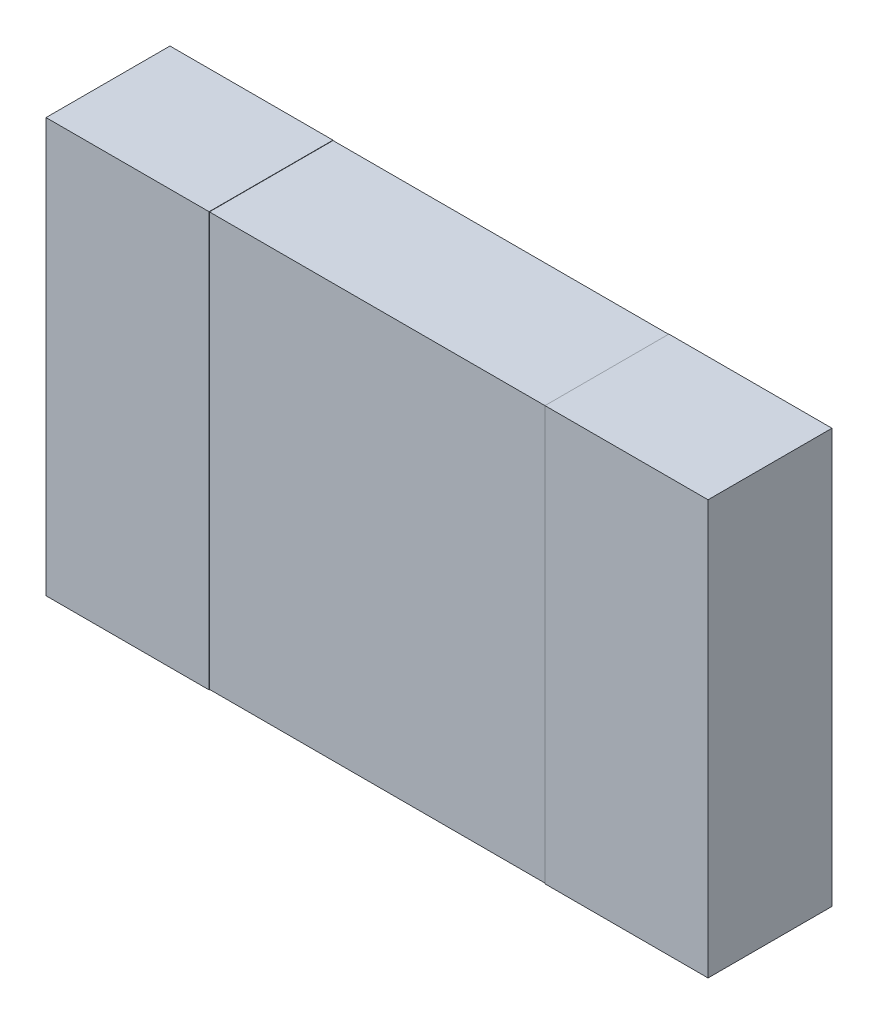
ISO-10303-21;
HEADER;
FILE_DESCRIPTION(('STEP AP214'),'2;1');
FILE_NAME('part.step','',(''),(''),'','','');
FILE_SCHEMA(('AUTOMOTIVE_DESIGN { 1 0 10303 214 1 1 1 1 }'));
ENDSEC;
DATA;
#1=APPLICATION_CONTEXT('core data for automotive mechanical design processes');
#2=APPLICATION_PROTOCOL_DEFINITION('international standard','automotive_design',2000,#1);
#3=PRODUCT_CONTEXT('',#1,'mechanical');
#4=PRODUCT('Part','Part','',(#3));
#5=PRODUCT_RELATED_PRODUCT_CATEGORY('part','',(#4));
#6=PRODUCT_DEFINITION_FORMATION('','',#4);
#7=PRODUCT_DEFINITION_CONTEXT('part definition',#1,'design');
#8=PRODUCT_DEFINITION('design','',#6,#7);
#9=PRODUCT_DEFINITION_SHAPE('','',#8);
#10=(LENGTH_UNIT() NAMED_UNIT(*) SI_UNIT(.MILLI.,.METRE.));
#11=(NAMED_UNIT(*) PLANE_ANGLE_UNIT() SI_UNIT($,.RADIAN.));
#12=(NAMED_UNIT(*) SI_UNIT($,.STERADIAN.) SOLID_ANGLE_UNIT());
#13=UNCERTAINTY_MEASURE_WITH_UNIT(LENGTH_MEASURE(1.E-05),#10,'distance_accuracy_value','');
#14=(GEOMETRIC_REPRESENTATION_CONTEXT(3) GLOBAL_UNCERTAINTY_ASSIGNED_CONTEXT((#13)) GLOBAL_UNIT_ASSIGNED_CONTEXT((#10,
#11,#12)) REPRESENTATION_CONTEXT('',''));
#15=CARTESIAN_POINT('',(0.,0.,0.));
#16=DIRECTION('',(0.,0.,1.));
#17=DIRECTION('',(1.,0.,0.));
#18=AXIS2_PLACEMENT_3D('',#15,#16,#17);
#19=CARTESIAN_POINT('',(0.,0.,0.38));
#20=DIRECTION('',(0.,0.,1.));
#21=DIRECTION('',(1.,0.,0.));
#22=AXIS2_PLACEMENT_3D('',#19,#20,#21);
#23=PLANE('',#22);
#24=DIRECTION('',(1.084202172485E-13,1.,0.));
#25=VECTOR('',#24,1.);
#26=CARTESIAN_POINT('',(0.515,0.635,0.38));
#27=LINE('',#26,#25);
#28=CARTESIAN_POINT('',(0.515,0.635,0.38));
#29=VERTEX_POINT('',#28);
#30=CARTESIAN_POINT('',(0.514999999999862,-0.635,0.38));
#31=VERTEX_POINT('',#30);
#32=EDGE_CURVE('E191',#29,#31,#27,.F.);
#33=ORIENTED_EDGE('',*,*,#32,.T.);
#34=DIRECTION('',(1.,0.,0.));
#35=VECTOR('',#34,1.);
#36=CARTESIAN_POINT('',(-1.015,-0.635,0.38));
#37=LINE('',#36,#35);
#38=CARTESIAN_POINT('',(1.015,-0.635,0.38));
#39=VERTEX_POINT('',#38);
#40=EDGE_CURVE('E121',#31,#39,#37,.T.);
#41=ORIENTED_EDGE('',*,*,#40,.T.);
#42=DIRECTION('',(0.,-1.,0.));
#43=VECTOR('',#42,1.);
#44=CARTESIAN_POINT('',(1.015,0.635,0.38));
#45=LINE('',#44,#43);
#46=CARTESIAN_POINT('',(1.015,0.635,0.38));
#47=VERTEX_POINT('',#46);
#48=EDGE_CURVE('E120',#39,#47,#45,.F.);
#49=ORIENTED_EDGE('',*,*,#48,.T.);
#50=DIRECTION('',(1.,0.,0.));
#51=VECTOR('',#50,1.);
#52=CARTESIAN_POINT('',(-1.015,0.635,0.38));
#53=LINE('',#52,#51);
#54=EDGE_CURVE('E118',#47,#29,#53,.F.);
#55=ORIENTED_EDGE('',*,*,#54,.T.);
#56=EDGE_LOOP('',(#33,#41,#49,#55));
#57=FACE_BOUND('',#56,.T.);
#58=ADVANCED_FACE('F17',(#57),#23,.T.);
#59=CARTESIAN_POINT('',(0.515,-0.635,0.379));
#60=DIRECTION('',(0.,0.,-1.));
#61=DIRECTION('',(-1.,0.,0.));
#62=AXIS2_PLACEMENT_3D('',#59,#60,#61);
#63=PLANE('',#62);
#64=DIRECTION('',(0.,1.,0.));
#65=VECTOR('',#64,1.);
#66=CARTESIAN_POINT('',(-0.515,0.635,0.379));
#67=LINE('',#66,#65);
#68=CARTESIAN_POINT('',(-0.515,0.634,0.379));
#69=VERTEX_POINT('',#68);
#70=CARTESIAN_POINT('',(-0.515,-0.634,0.379));
#71=VERTEX_POINT('',#70);
#72=EDGE_CURVE('E171',#69,#71,#67,.F.);
#73=ORIENTED_EDGE('',*,*,#72,.T.);
#74=DIRECTION('',(1.,0.,0.));
#75=VECTOR('',#74,1.);
#76=CARTESIAN_POINT('',(0.515,-0.634,0.379));
#77=LINE('',#76,#75);
#78=CARTESIAN_POINT('',(0.514999999999893,-0.634,0.379));
#79=VERTEX_POINT('',#78);
#80=EDGE_CURVE('E100',#71,#79,#77,.T.);
#81=ORIENTED_EDGE('',*,*,#80,.T.);
#82=DIRECTION('',(1.084202172485E-13,1.,0.));
#83=VECTOR('',#82,1.);
#84=CARTESIAN_POINT('',(0.515,0.635,0.379));
#85=LINE('',#84,#83);
#86=CARTESIAN_POINT('',(0.515,0.634,0.379));
#87=VERTEX_POINT('',#86);
#88=EDGE_CURVE('E104',#79,#87,#85,.T.);
#89=ORIENTED_EDGE('',*,*,#88,.T.);
#90=DIRECTION('',(1.,0.,0.));
#91=VECTOR('',#90,1.);
#92=CARTESIAN_POINT('',(0.515,0.634,0.379));
#93=LINE('',#92,#91);
#94=EDGE_CURVE('E152',#87,#69,#93,.F.);
#95=ORIENTED_EDGE('',*,*,#94,.T.);
#96=EDGE_LOOP('',(#73,#81,#89,#95));
#97=FACE_BOUND('',#96,.T.);
#98=ADVANCED_FACE('F269',(#97),#63,.F.);
#99=CARTESIAN_POINT('',(0.,0.,0.38));
#100=DIRECTION('',(0.,0.,1.));
#101=DIRECTION('',(1.,0.,0.));
#102=AXIS2_PLACEMENT_3D('',#99,#100,#101);
#103=PLANE('',#102);
#104=DIRECTION('',(1.,0.,0.));
#105=VECTOR('',#104,1.);
#106=CARTESIAN_POINT('',(-1.015,-0.635,0.38));
#107=LINE('',#106,#105);
#108=CARTESIAN_POINT('',(-1.015,-0.635,0.38));
#109=VERTEX_POINT('',#108);
#110=CARTESIAN_POINT('',(-0.515,-0.635,0.38));
#111=VERTEX_POINT('',#110);
#112=EDGE_CURVE('E161',#109,#111,#107,.T.);
#113=ORIENTED_EDGE('',*,*,#112,.T.);
#114=DIRECTION('',(0.,1.,0.));
#115=VECTOR('',#114,1.);
#116=CARTESIAN_POINT('',(-0.515,0.635,0.38));
#117=LINE('',#116,#115);
#118=CARTESIAN_POINT('',(-0.515,0.635,0.38));
#119=VERTEX_POINT('',#118);
#120=EDGE_CURVE('E155',#111,#119,#117,.T.);
#121=ORIENTED_EDGE('',*,*,#120,.T.);
#122=DIRECTION('',(1.,0.,0.));
#123=VECTOR('',#122,1.);
#124=CARTESIAN_POINT('',(-1.015,0.635,0.38));
#125=LINE('',#124,#123);
#126=CARTESIAN_POINT('',(-1.015,0.635,0.38));
#127=VERTEX_POINT('',#126);
#128=EDGE_CURVE('E149',#119,#127,#125,.F.);
#129=ORIENTED_EDGE('',*,*,#128,.T.);
#130=DIRECTION('',(0.,1.,0.));
#131=VECTOR('',#130,1.);
#132=CARTESIAN_POINT('',(-1.015,0.635,0.38));
#133=LINE('',#132,#131);
#134=EDGE_CURVE('E180',#127,#109,#133,.F.);
#135=ORIENTED_EDGE('',*,*,#134,.T.);
#136=EDGE_LOOP('',(#113,#121,#129,#135));
#137=FACE_BOUND('',#136,.T.);
#138=ADVANCED_FACE('F363',(#137),#103,.T.);
#139=CARTESIAN_POINT('',(0.515,-0.634,0.38));
#140=DIRECTION('',(0.,1.,0.));
#141=DIRECTION('',(0.,0.,1.));
#142=AXIS2_PLACEMENT_3D('',#139,#140,#141);
#143=PLANE('',#142);
#144=DIRECTION('',(0.,0.,1.));
#145=VECTOR('',#144,1.);
#146=CARTESIAN_POINT('',(-0.515,-0.634,0.38));
#147=LINE('',#146,#145);
#148=CARTESIAN_POINT('',(-0.515,-0.634,0.));
#149=VERTEX_POINT('',#148);
#150=EDGE_CURVE('E173',#71,#149,#147,.F.);
#151=ORIENTED_EDGE('',*,*,#150,.T.);
#152=DIRECTION('',(1.,0.,0.));
#153=VECTOR('',#152,1.);
#154=CARTESIAN_POINT('',(0.,-0.634,0.));
#155=LINE('',#154,#153);
#156=CARTESIAN_POINT('',(0.514999999999862,-0.634,0.));
#157=VERTEX_POINT('',#156);
#158=EDGE_CURVE('E217',#149,#157,#155,.T.);
#159=ORIENTED_EDGE('',*,*,#158,.T.);
#160=DIRECTION('',(0.,0.,1.));
#161=VECTOR('',#160,1.);
#162=CARTESIAN_POINT('',(0.514999999999862,-0.634,0.38));
#163=LINE('',#162,#161);
#164=EDGE_CURVE('E65',#157,#79,#163,.T.);
#165=ORIENTED_EDGE('',*,*,#164,.T.);
#166=ORIENTED_EDGE('',*,*,#80,.F.);
#167=EDGE_LOOP('',(#151,#159,#165,#166));
#168=FACE_BOUND('',#167,.T.);
#169=ADVANCED_FACE('F256',(#168),#143,.F.);
#170=CARTESIAN_POINT('',(-1.015,-0.635,0.38));
#171=DIRECTION('',(0.,1.,0.));
#172=DIRECTION('',(0.,0.,1.));
#173=AXIS2_PLACEMENT_3D('',#170,#171,#172);
#174=PLANE('',#173);
#175=DIRECTION('',(1.,0.,0.));
#176=VECTOR('',#175,1.);
#177=CARTESIAN_POINT('',(0.,-0.635,0.));
#178=LINE('',#177,#176);
#179=CARTESIAN_POINT('',(0.514999999999862,-0.635,0.));
#180=VERTEX_POINT('',#179);
#181=CARTESIAN_POINT('',(1.015,-0.635,0.));
#182=VERTEX_POINT('',#181);
#183=EDGE_CURVE('E143',#180,#182,#178,.T.);
#184=ORIENTED_EDGE('',*,*,#183,.T.);
#185=DIRECTION('',(0.,0.,1.));
#186=VECTOR('',#185,1.);
#187=CARTESIAN_POINT('',(1.015,-0.635,0.38));
#188=LINE('',#187,#186);
#189=EDGE_CURVE('E81',#182,#39,#188,.T.);
#190=ORIENTED_EDGE('',*,*,#189,.T.);
#191=ORIENTED_EDGE('',*,*,#40,.F.);
#192=DIRECTION('',(0.,0.,1.));
#193=VECTOR('',#192,1.);
#194=CARTESIAN_POINT('',(0.514999999999862,-0.635,0.38));
#195=LINE('',#194,#193);
#196=EDGE_CURVE('E73',#31,#180,#195,.F.);
#197=ORIENTED_EDGE('',*,*,#196,.T.);
#198=EDGE_LOOP('',(#184,#190,#191,#197));
#199=FACE_BOUND('',#198,.T.);
#200=ADVANCED_FACE('F350',(#199),#174,.F.);
#201=CARTESIAN_POINT('',(1.015,0.635,0.38));
#202=DIRECTION('',(-1.,0.,0.));
#203=DIRECTION('',(0.,-1.,0.));
#204=AXIS2_PLACEMENT_3D('',#201,#202,#203);
#205=PLANE('',#204);
#206=ORIENTED_EDGE('',*,*,#48,.F.);
#207=ORIENTED_EDGE('',*,*,#189,.F.);
#208=DIRECTION('',(0.,1.,0.));
#209=VECTOR('',#208,1.);
#210=CARTESIAN_POINT('',(1.015,0.,0.));
#211=LINE('',#210,#209);
#212=CARTESIAN_POINT('',(1.015,0.635,0.));
#213=VERTEX_POINT('',#212);
#214=EDGE_CURVE('E133',#182,#213,#211,.T.);
#215=ORIENTED_EDGE('',*,*,#214,.T.);
#216=DIRECTION('',(0.,0.,-1.));
#217=VECTOR('',#216,1.);
#218=CARTESIAN_POINT('',(1.015,0.635,0.38));
#219=LINE('',#218,#217);
#220=EDGE_CURVE('E123',#213,#47,#219,.F.);
#221=ORIENTED_EDGE('',*,*,#220,.T.);
#222=EDGE_LOOP('',(#206,#207,#215,#221));
#223=FACE_BOUND('',#222,.T.);
#224=ADVANCED_FACE('F132',(#223),#205,.F.);
#225=CARTESIAN_POINT('',(-1.015,0.635,0.38));
#226=DIRECTION('',(0.,-1.,0.));
#227=DIRECTION('',(0.,0.,-1.));
#228=AXIS2_PLACEMENT_3D('',#225,#226,#227);
#229=PLANE('',#228);
#230=ORIENTED_EDGE('',*,*,#54,.F.);
#231=ORIENTED_EDGE('',*,*,#220,.F.);
#232=DIRECTION('',(1.,0.,0.));
#233=VECTOR('',#232,1.);
#234=CARTESIAN_POINT('',(0.,0.635,0.));
#235=LINE('',#234,#233);
#236=CARTESIAN_POINT('',(0.515,0.635,0.));
#237=VERTEX_POINT('',#236);
#238=EDGE_CURVE('E142',#213,#237,#235,.F.);
#239=ORIENTED_EDGE('',*,*,#238,.T.);
#240=DIRECTION('',(0.,0.,1.));
#241=VECTOR('',#240,1.);
#242=CARTESIAN_POINT('',(0.515,0.635,0.38));
#243=LINE('',#242,#241);
#244=EDGE_CURVE('E130',#237,#29,#243,.T.);
#245=ORIENTED_EDGE('',*,*,#244,.T.);
#246=EDGE_LOOP('',(#230,#231,#239,#245));
#247=FACE_BOUND('',#246,.T.);
#248=ADVANCED_FACE('F127',(#247),#229,.F.);
#249=CARTESIAN_POINT('',(0.515,0.635,0.38));
#250=DIRECTION('',(1.,-1.084202172485E-13,0.));
#251=DIRECTION('',(1.084202172485E-13,1.,0.));
#252=AXIS2_PLACEMENT_3D('',#249,#250,#251);
#253=PLANE('',#252);
#254=ORIENTED_EDGE('',*,*,#88,.F.);
#255=ORIENTED_EDGE('',*,*,#164,.F.);
#256=DIRECTION('',(1.084202172485E-13,1.,0.));
#257=VECTOR('',#256,1.);
#258=CARTESIAN_POINT('',(0.515,0.635,0.));
#259=LINE('',#258,#257);
#260=EDGE_CURVE('E20',#157,#180,#259,.F.);
#261=ORIENTED_EDGE('',*,*,#260,.T.);
#262=ORIENTED_EDGE('',*,*,#196,.F.);
#263=ORIENTED_EDGE('',*,*,#32,.F.);
#264=ORIENTED_EDGE('',*,*,#244,.F.);
#265=DIRECTION('',(1.084202172485E-13,1.,0.));
#266=VECTOR('',#265,1.);
#267=CARTESIAN_POINT('',(0.515,0.635,0.));
#268=LINE('',#267,#266);
#269=CARTESIAN_POINT('',(0.515,0.634,0.));
#270=VERTEX_POINT('',#269);
#271=EDGE_CURVE('E203',#237,#270,#268,.F.);
#272=ORIENTED_EDGE('',*,*,#271,.T.);
#273=DIRECTION('',(0.,0.,-1.));
#274=VECTOR('',#273,1.);
#275=CARTESIAN_POINT('',(0.515,0.634,0.38));
#276=LINE('',#275,#274);
#277=EDGE_CURVE('E177',#270,#87,#276,.F.);
#278=ORIENTED_EDGE('',*,*,#277,.T.);
#279=EDGE_LOOP('',(#254,#255,#261,#262,#263,#264,#272,#278));
#280=FACE_BOUND('',#279,.T.);
#281=ADVANCED_FACE('F262',(#280),#253,.F.);
#282=CARTESIAN_POINT('',(0.515,0.634,0.38));
#283=DIRECTION('',(0.,-1.,0.));
#284=DIRECTION('',(0.,0.,-1.));
#285=AXIS2_PLACEMENT_3D('',#282,#283,#284);
#286=PLANE('',#285);
#287=ORIENTED_EDGE('',*,*,#277,.F.);
#288=DIRECTION('',(1.,0.,0.));
#289=VECTOR('',#288,1.);
#290=CARTESIAN_POINT('',(0.,0.634,0.));
#291=LINE('',#290,#289);
#292=CARTESIAN_POINT('',(-0.515,0.634,0.));
#293=VERTEX_POINT('',#292);
#294=EDGE_CURVE('E202',#270,#293,#291,.F.);
#295=ORIENTED_EDGE('',*,*,#294,.T.);
#296=DIRECTION('',(0.,0.,1.));
#297=VECTOR('',#296,1.);
#298=CARTESIAN_POINT('',(-0.515,0.634,0.38));
#299=LINE('',#298,#297);
#300=EDGE_CURVE('E164',#293,#69,#299,.T.);
#301=ORIENTED_EDGE('',*,*,#300,.T.);
#302=ORIENTED_EDGE('',*,*,#94,.F.);
#303=EDGE_LOOP('',(#287,#295,#301,#302));
#304=FACE_BOUND('',#303,.T.);
#305=ADVANCED_FACE('F267',(#304),#286,.F.);
#306=CARTESIAN_POINT('',(-1.015,0.635,0.38));
#307=DIRECTION('',(0.,-1.,0.));
#308=DIRECTION('',(0.,0.,-1.));
#309=AXIS2_PLACEMENT_3D('',#306,#307,#308);
#310=PLANE('',#309);
#311=DIRECTION('',(1.,0.,0.));
#312=VECTOR('',#311,1.);
#313=CARTESIAN_POINT('',(0.,0.635,0.));
#314=LINE('',#313,#312);
#315=CARTESIAN_POINT('',(-0.515,0.635,0.));
#316=VERTEX_POINT('',#315);
#317=CARTESIAN_POINT('',(-1.015,0.635,0.));
#318=VERTEX_POINT('',#317);
#319=EDGE_CURVE('E201',#316,#318,#314,.F.);
#320=ORIENTED_EDGE('',*,*,#319,.T.);
#321=DIRECTION('',(0.,0.,1.));
#322=VECTOR('',#321,1.);
#323=CARTESIAN_POINT('',(-1.015,0.635,0.38));
#324=LINE('',#323,#322);
#325=EDGE_CURVE('E151',#318,#127,#324,.T.);
#326=ORIENTED_EDGE('',*,*,#325,.T.);
#327=ORIENTED_EDGE('',*,*,#128,.F.);
#328=DIRECTION('',(0.,0.,1.));
#329=VECTOR('',#328,1.);
#330=CARTESIAN_POINT('',(-0.515,0.635,0.38));
#331=LINE('',#330,#329);
#332=EDGE_CURVE('E158',#119,#316,#331,.F.);
#333=ORIENTED_EDGE('',*,*,#332,.T.);
#334=EDGE_LOOP('',(#320,#326,#327,#333));
#335=FACE_BOUND('',#334,.T.);
#336=ADVANCED_FACE('F285',(#335),#310,.F.);
#337=CARTESIAN_POINT('',(-1.015,0.635,0.38));
#338=DIRECTION('',(1.,0.,0.));
#339=DIRECTION('',(0.,1.,0.));
#340=AXIS2_PLACEMENT_3D('',#337,#338,#339);
#341=PLANE('',#340);
#342=ORIENTED_EDGE('',*,*,#134,.F.);
#343=ORIENTED_EDGE('',*,*,#325,.F.);
#344=DIRECTION('',(0.,1.,0.));
#345=VECTOR('',#344,1.);
#346=CARTESIAN_POINT('',(-1.015,0.,0.));
#347=LINE('',#346,#345);
#348=CARTESIAN_POINT('',(-1.015,-0.635,0.));
#349=VERTEX_POINT('',#348);
#350=EDGE_CURVE('E238',#318,#349,#347,.F.);
#351=ORIENTED_EDGE('',*,*,#350,.T.);
#352=DIRECTION('',(0.,0.,1.));
#353=VECTOR('',#352,1.);
#354=CARTESIAN_POINT('',(-1.015,-0.635,0.38));
#355=LINE('',#354,#353);
#356=EDGE_CURVE('E165',#349,#109,#355,.T.);
#357=ORIENTED_EDGE('',*,*,#356,.T.);
#358=EDGE_LOOP('',(#342,#343,#351,#357));
#359=FACE_BOUND('',#358,.T.);
#360=ADVANCED_FACE('F282',(#359),#341,.F.);
#361=CARTESIAN_POINT('',(-1.015,-0.635,0.38));
#362=DIRECTION('',(0.,1.,0.));
#363=DIRECTION('',(0.,0.,1.));
#364=AXIS2_PLACEMENT_3D('',#361,#362,#363);
#365=PLANE('',#364);
#366=ORIENTED_EDGE('',*,*,#112,.F.);
#367=ORIENTED_EDGE('',*,*,#356,.F.);
#368=DIRECTION('',(1.,0.,0.));
#369=VECTOR('',#368,1.);
#370=CARTESIAN_POINT('',(0.,-0.635,0.));
#371=LINE('',#370,#369);
#372=CARTESIAN_POINT('',(-0.515,-0.635,0.));
#373=VERTEX_POINT('',#372);
#374=EDGE_CURVE('E26',#349,#373,#371,.T.);
#375=ORIENTED_EDGE('',*,*,#374,.T.);
#376=DIRECTION('',(0.,0.,1.));
#377=VECTOR('',#376,1.);
#378=CARTESIAN_POINT('',(-0.515,-0.635,0.38));
#379=LINE('',#378,#377);
#380=EDGE_CURVE('E34',#373,#111,#379,.T.);
#381=ORIENTED_EDGE('',*,*,#380,.T.);
#382=EDGE_LOOP('',(#366,#367,#375,#381));
#383=FACE_BOUND('',#382,.T.);
#384=ADVANCED_FACE('F293',(#383),#365,.F.);
#385=CARTESIAN_POINT('',(-0.515,0.635,0.38));
#386=DIRECTION('',(-1.,0.,0.));
#387=DIRECTION('',(0.,0.,1.));
#388=AXIS2_PLACEMENT_3D('',#385,#386,#387);
#389=PLANE('',#388);
#390=ORIENTED_EDGE('',*,*,#120,.F.);
#391=ORIENTED_EDGE('',*,*,#380,.F.);
#392=DIRECTION('',(0.,1.,0.));
#393=VECTOR('',#392,1.);
#394=CARTESIAN_POINT('',(-0.515,0.635,0.));
#395=LINE('',#394,#393);
#396=EDGE_CURVE('E11',#373,#149,#395,.T.);
#397=ORIENTED_EDGE('',*,*,#396,.T.);
#398=ORIENTED_EDGE('',*,*,#150,.F.);
#399=ORIENTED_EDGE('',*,*,#72,.F.);
#400=ORIENTED_EDGE('',*,*,#300,.F.);
#401=DIRECTION('',(0.,1.,0.));
#402=VECTOR('',#401,1.);
#403=CARTESIAN_POINT('',(-0.515,0.635,0.));
#404=LINE('',#403,#402);
#405=EDGE_CURVE('E199',#293,#316,#404,.T.);
#406=ORIENTED_EDGE('',*,*,#405,.T.);
#407=ORIENTED_EDGE('',*,*,#332,.F.);
#408=EDGE_LOOP('',(#390,#391,#397,#398,#399,#400,#406,#407));
#409=FACE_BOUND('',#408,.T.);
#410=ADVANCED_FACE('F270',(#409),#389,.F.);
#411=CARTESIAN_POINT('',(0.,0.,0.));
#412=DIRECTION('',(0.,0.,1.));
#413=DIRECTION('',(1.,0.,0.));
#414=AXIS2_PLACEMENT_3D('',#411,#412,#413);
#415=PLANE('',#414);
#416=ORIENTED_EDGE('',*,*,#374,.F.);
#417=ORIENTED_EDGE('',*,*,#350,.F.);
#418=ORIENTED_EDGE('',*,*,#319,.F.);
#419=ORIENTED_EDGE('',*,*,#405,.F.);
#420=ORIENTED_EDGE('',*,*,#294,.F.);
#421=ORIENTED_EDGE('',*,*,#271,.F.);
#422=ORIENTED_EDGE('',*,*,#238,.F.);
#423=ORIENTED_EDGE('',*,*,#214,.F.);
#424=ORIENTED_EDGE('',*,*,#183,.F.);
#425=ORIENTED_EDGE('',*,*,#260,.F.);
#426=ORIENTED_EDGE('',*,*,#158,.F.);
#427=ORIENTED_EDGE('',*,*,#396,.F.);
#428=EDGE_LOOP('',(#416,#417,#418,#419,#420,#421,#422,#423,#424,#425,#426,#427));
#429=FACE_BOUND('',#428,.T.);
#430=ADVANCED_FACE('F260',(#429),#415,.F.);
#431=CLOSED_SHELL('',(#58,#98,#138,#169,#200,#224,#248,#281,#305,#336,#360,#384,#410,#430));
#432=MANIFOLD_SOLID_BREP('B1',#431);
#433=ADVANCED_BREP_SHAPE_REPRESENTATION('',(#18,#432),#14);
#434=SHAPE_DEFINITION_REPRESENTATION(#9,#433);
ENDSEC;
END-ISO-10303-21;
